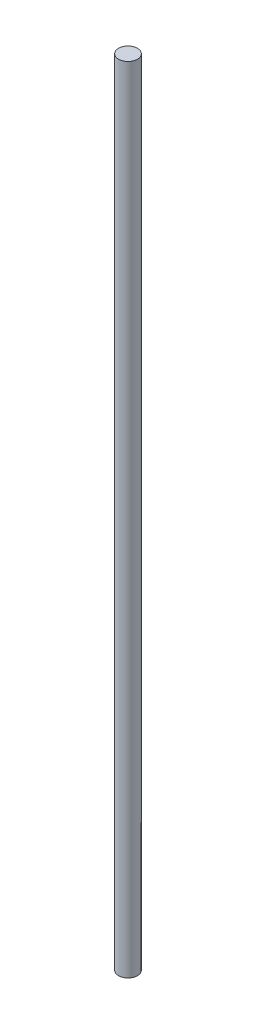
ISO-10303-21;
HEADER;
FILE_DESCRIPTION(('STEP AP214'),'2;1');
FILE_NAME('part.step','',(''),(''),'','','');
FILE_SCHEMA(('AUTOMOTIVE_DESIGN { 1 0 10303 214 1 1 1 1 }'));
ENDSEC;
DATA;
#1=APPLICATION_CONTEXT('core data for automotive mechanical design processes');
#2=APPLICATION_PROTOCOL_DEFINITION('international standard','automotive_design',2000,#1);
#3=PRODUCT_CONTEXT('',#1,'mechanical');
#4=PRODUCT('Part','Part','',(#3));
#5=PRODUCT_RELATED_PRODUCT_CATEGORY('part','',(#4));
#6=PRODUCT_DEFINITION_FORMATION('','',#4);
#7=PRODUCT_DEFINITION_CONTEXT('part definition',#1,'design');
#8=PRODUCT_DEFINITION('design','',#6,#7);
#9=PRODUCT_DEFINITION_SHAPE('','',#8);
#10=(LENGTH_UNIT() NAMED_UNIT(*) SI_UNIT(.MILLI.,.METRE.));
#11=(NAMED_UNIT(*) PLANE_ANGLE_UNIT() SI_UNIT($,.RADIAN.));
#12=(NAMED_UNIT(*) SI_UNIT($,.STERADIAN.) SOLID_ANGLE_UNIT());
#13=UNCERTAINTY_MEASURE_WITH_UNIT(LENGTH_MEASURE(1.E-05),#10,'distance_accuracy_value','');
#14=(GEOMETRIC_REPRESENTATION_CONTEXT(3) GLOBAL_UNCERTAINTY_ASSIGNED_CONTEXT((#13)) GLOBAL_UNIT_ASSIGNED_CONTEXT((#10,
#11,#12)) REPRESENTATION_CONTEXT('',''));
#15=CARTESIAN_POINT('',(0.,0.,0.));
#16=DIRECTION('',(0.,0.,1.));
#17=DIRECTION('',(1.,0.,0.));
#18=AXIS2_PLACEMENT_3D('',#15,#16,#17);
#19=CARTESIAN_POINT('',(0.,630.,0.));
#20=DIRECTION('',(0.,-1.,0.));
#21=DIRECTION('',(0.,0.,-1.));
#22=AXIS2_PLACEMENT_3D('',#19,#20,#21);
#23=CYLINDRICAL_SURFACE('',#22,7.5);
#24=CARTESIAN_POINT('',(0.,630.,0.));
#25=DIRECTION('',(0.,1.,0.));
#26=DIRECTION('',(0.,0.,1.));
#27=AXIS2_PLACEMENT_3D('',#24,#25,#26);
#28=CIRCLE('',#27,7.5);
#29=CARTESIAN_POINT('',(0.,630.,7.5));
#30=VERTEX_POINT('',#29);
#31=EDGE_CURVE('E10',#30,#30,#28,.T.);
#32=ORIENTED_EDGE('',*,*,#31,.F.);
#33=EDGE_LOOP('',(#32));
#34=FACE_BOUND('',#33,.T.);
#35=CARTESIAN_POINT('',(0.,0.,0.));
#36=DIRECTION('',(0.,1.,0.));
#37=DIRECTION('',(0.,0.,1.));
#38=AXIS2_PLACEMENT_3D('',#35,#36,#37);
#39=CIRCLE('',#38,7.5);
#40=CARTESIAN_POINT('',(0.,0.,7.5));
#41=VERTEX_POINT('',#40);
#42=EDGE_CURVE('E42',#41,#41,#39,.T.);
#43=ORIENTED_EDGE('',*,*,#42,.T.);
#44=EDGE_LOOP('',(#43));
#45=FACE_BOUND('',#44,.T.);
#46=ADVANCED_FACE('F39',(#34,#45),#23,.T.);
#47=CARTESIAN_POINT('',(0.,630.,0.));
#48=DIRECTION('',(0.,1.,0.));
#49=DIRECTION('',(0.,0.,1.));
#50=AXIS2_PLACEMENT_3D('',#47,#48,#49);
#51=PLANE('',#50);
#52=ORIENTED_EDGE('',*,*,#31,.T.);
#53=EDGE_LOOP('',(#52));
#54=FACE_BOUND('',#53,.T.);
#55=ADVANCED_FACE('F56',(#54),#51,.T.);
#56=CARTESIAN_POINT('',(0.,0.,0.));
#57=DIRECTION('',(0.,1.,0.));
#58=DIRECTION('',(0.,0.,1.));
#59=AXIS2_PLACEMENT_3D('',#56,#57,#58);
#60=PLANE('',#59);
#61=ORIENTED_EDGE('',*,*,#42,.F.);
#62=EDGE_LOOP('',(#61));
#63=FACE_BOUND('',#62,.T.);
#64=ADVANCED_FACE('F54',(#63),#60,.F.);
#65=CLOSED_SHELL('',(#46,#55,#64));
#66=MANIFOLD_SOLID_BREP('B2',#65);
#67=ADVANCED_BREP_SHAPE_REPRESENTATION('',(#18,#66),#14);
#68=SHAPE_DEFINITION_REPRESENTATION(#9,#67);
ENDSEC;
END-ISO-10303-21;
